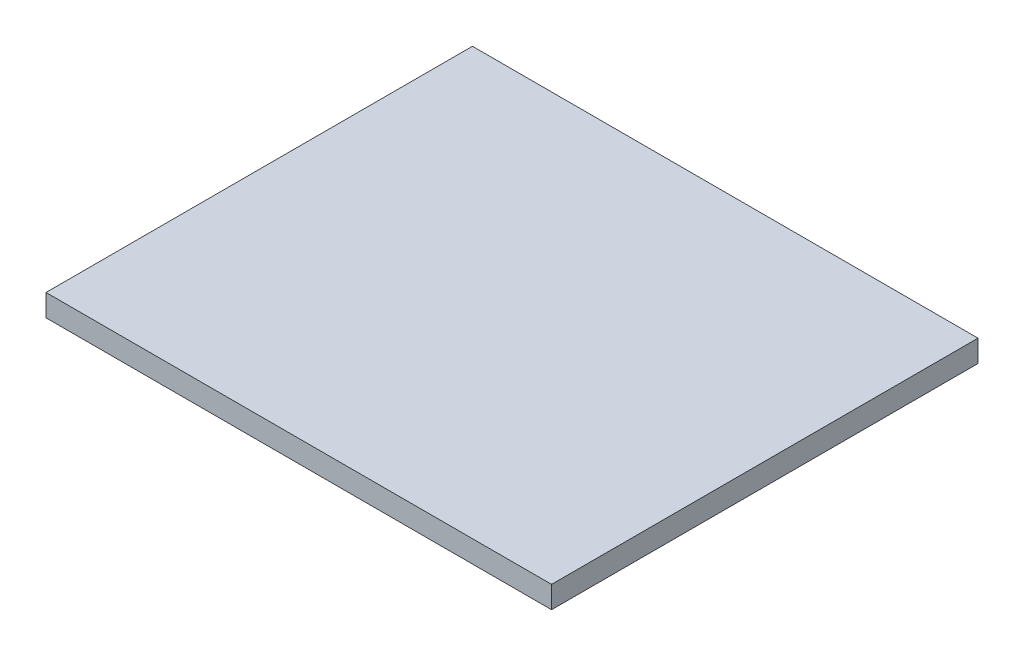
ISO-10303-21;
HEADER;
FILE_DESCRIPTION(('STEP AP214'),'2;1');
FILE_NAME('part.step','',(''),(''),'','','');
FILE_SCHEMA(('AUTOMOTIVE_DESIGN { 1 0 10303 214 1 1 1 1 }'));
ENDSEC;
DATA;
#1=APPLICATION_CONTEXT('core data for automotive mechanical design processes');
#2=APPLICATION_PROTOCOL_DEFINITION('international standard','automotive_design',2000,#1);
#3=PRODUCT_CONTEXT('',#1,'mechanical');
#4=PRODUCT('Part','Part','',(#3));
#5=PRODUCT_RELATED_PRODUCT_CATEGORY('part','',(#4));
#6=PRODUCT_DEFINITION_FORMATION('','',#4);
#7=PRODUCT_DEFINITION_CONTEXT('part definition',#1,'design');
#8=PRODUCT_DEFINITION('design','',#6,#7);
#9=PRODUCT_DEFINITION_SHAPE('','',#8);
#10=(LENGTH_UNIT() NAMED_UNIT(*) SI_UNIT(.MILLI.,.METRE.));
#11=(NAMED_UNIT(*) PLANE_ANGLE_UNIT() SI_UNIT($,.RADIAN.));
#12=(NAMED_UNIT(*) SI_UNIT($,.STERADIAN.) SOLID_ANGLE_UNIT());
#13=UNCERTAINTY_MEASURE_WITH_UNIT(LENGTH_MEASURE(1.E-05),#10,'distance_accuracy_value','');
#14=(GEOMETRIC_REPRESENTATION_CONTEXT(3) GLOBAL_UNCERTAINTY_ASSIGNED_CONTEXT((#13)) GLOBAL_UNIT_ASSIGNED_CONTEXT((#10,
#11,#12)) REPRESENTATION_CONTEXT('',''));
#15=CARTESIAN_POINT('',(0.,0.,0.));
#16=DIRECTION('',(0.,0.,1.));
#17=DIRECTION('',(1.,0.,0.));
#18=AXIS2_PLACEMENT_3D('',#15,#16,#17);
#19=CARTESIAN_POINT('',(0.,10.,0.));
#20=DIRECTION('',(1.,0.,0.));
#21=DIRECTION('',(0.,0.,-1.));
#22=AXIS2_PLACEMENT_3D('',#19,#20,#21);
#23=PLANE('',#22);
#24=DIRECTION('',(0.,0.,1.));
#25=VECTOR('',#24,1.);
#26=CARTESIAN_POINT('',(0.,0.,0.));
#27=LINE('',#26,#25);
#28=CARTESIAN_POINT('',(0.,0.,0.));
#29=VERTEX_POINT('',#28);
#30=CARTESIAN_POINT('',(0.,0.,194.));
#31=VERTEX_POINT('',#30);
#32=EDGE_CURVE('E97',#29,#31,#27,.T.);
#33=ORIENTED_EDGE('',*,*,#32,.T.);
#34=DIRECTION('',(0.,-1.,0.));
#35=VECTOR('',#34,1.);
#36=CARTESIAN_POINT('',(0.,10.,194.));
#37=LINE('',#36,#35);
#38=CARTESIAN_POINT('',(0.,10.,194.));
#39=VERTEX_POINT('',#38);
#40=EDGE_CURVE('E11',#39,#31,#37,.T.);
#41=ORIENTED_EDGE('',*,*,#40,.F.);
#42=DIRECTION('',(0.,0.,1.));
#43=VECTOR('',#42,1.);
#44=CARTESIAN_POINT('',(0.,10.,0.));
#45=LINE('',#44,#43);
#46=CARTESIAN_POINT('',(0.,10.,0.));
#47=VERTEX_POINT('',#46);
#48=EDGE_CURVE('E85',#47,#39,#45,.T.);
#49=ORIENTED_EDGE('',*,*,#48,.F.);
#50=DIRECTION('',(0.,-1.,0.));
#51=VECTOR('',#50,1.);
#52=CARTESIAN_POINT('',(0.,10.,0.));
#53=LINE('',#52,#51);
#54=EDGE_CURVE('E93',#47,#29,#53,.T.);
#55=ORIENTED_EDGE('',*,*,#54,.T.);
#56=EDGE_LOOP('',(#33,#41,#49,#55));
#57=FACE_BOUND('',#56,.T.);
#58=ADVANCED_FACE('F34',(#57),#23,.F.);
#59=CARTESIAN_POINT('',(0.,10.,194.));
#60=DIRECTION('',(0.,0.,-1.));
#61=DIRECTION('',(-1.,0.,0.));
#62=AXIS2_PLACEMENT_3D('',#59,#60,#61);
#63=PLANE('',#62);
#64=DIRECTION('',(1.,0.,0.));
#65=VECTOR('',#64,1.);
#66=CARTESIAN_POINT('',(0.,0.,194.));
#67=LINE('',#66,#65);
#68=CARTESIAN_POINT('',(230.,0.,194.));
#69=VERTEX_POINT('',#68);
#70=EDGE_CURVE('E89',#31,#69,#67,.T.);
#71=ORIENTED_EDGE('',*,*,#70,.T.);
#72=DIRECTION('',(0.,-1.,0.));
#73=VECTOR('',#72,1.);
#74=CARTESIAN_POINT('',(230.,10.,194.));
#75=LINE('',#74,#73);
#76=CARTESIAN_POINT('',(230.,10.,194.));
#77=VERTEX_POINT('',#76);
#78=EDGE_CURVE('E42',#77,#69,#75,.T.);
#79=ORIENTED_EDGE('',*,*,#78,.F.);
#80=DIRECTION('',(1.,0.,0.));
#81=VECTOR('',#80,1.);
#82=CARTESIAN_POINT('',(0.,10.,194.));
#83=LINE('',#82,#81);
#84=EDGE_CURVE('E80',#39,#77,#83,.T.);
#85=ORIENTED_EDGE('',*,*,#84,.F.);
#86=ORIENTED_EDGE('',*,*,#40,.T.);
#87=EDGE_LOOP('',(#71,#79,#85,#86));
#88=FACE_BOUND('',#87,.T.);
#89=ADVANCED_FACE('F88',(#88),#63,.F.);
#90=CARTESIAN_POINT('',(230.,10.,0.));
#91=DIRECTION('',(-1.,0.,0.));
#92=DIRECTION('',(0.,0.,1.));
#93=AXIS2_PLACEMENT_3D('',#90,#91,#92);
#94=PLANE('',#93);
#95=DIRECTION('',(0.,0.,-1.));
#96=VECTOR('',#95,1.);
#97=CARTESIAN_POINT('',(230.,0.,0.));
#98=LINE('',#97,#96);
#99=CARTESIAN_POINT('',(230.,0.,0.));
#100=VERTEX_POINT('',#99);
#101=EDGE_CURVE('E67',#69,#100,#98,.T.);
#102=ORIENTED_EDGE('',*,*,#101,.T.);
#103=DIRECTION('',(0.,-1.,0.));
#104=VECTOR('',#103,1.);
#105=CARTESIAN_POINT('',(230.,10.,0.));
#106=LINE('',#105,#104);
#107=CARTESIAN_POINT('',(230.,10.,0.));
#108=VERTEX_POINT('',#107);
#109=EDGE_CURVE('E90',#108,#100,#106,.T.);
#110=ORIENTED_EDGE('',*,*,#109,.F.);
#111=DIRECTION('',(0.,0.,-1.));
#112=VECTOR('',#111,1.);
#113=CARTESIAN_POINT('',(230.,10.,0.));
#114=LINE('',#113,#112);
#115=EDGE_CURVE('E83',#77,#108,#114,.T.);
#116=ORIENTED_EDGE('',*,*,#115,.F.);
#117=ORIENTED_EDGE('',*,*,#78,.T.);
#118=EDGE_LOOP('',(#102,#110,#116,#117));
#119=FACE_BOUND('',#118,.T.);
#120=ADVANCED_FACE('F91',(#119),#94,.F.);
#121=CARTESIAN_POINT('',(0.,10.,0.));
#122=DIRECTION('',(0.,0.,1.));
#123=DIRECTION('',(1.,0.,0.));
#124=AXIS2_PLACEMENT_3D('',#121,#122,#123);
#125=PLANE('',#124);
#126=DIRECTION('',(-1.,0.,0.));
#127=VECTOR('',#126,1.);
#128=CARTESIAN_POINT('',(0.,0.,0.));
#129=LINE('',#128,#127);
#130=EDGE_CURVE('E73',#100,#29,#129,.T.);
#131=ORIENTED_EDGE('',*,*,#130,.T.);
#132=ORIENTED_EDGE('',*,*,#54,.F.);
#133=DIRECTION('',(-1.,0.,0.));
#134=VECTOR('',#133,1.);
#135=CARTESIAN_POINT('',(0.,10.,0.));
#136=LINE('',#135,#134);
#137=EDGE_CURVE('E50',#108,#47,#136,.T.);
#138=ORIENTED_EDGE('',*,*,#137,.F.);
#139=ORIENTED_EDGE('',*,*,#109,.T.);
#140=EDGE_LOOP('',(#131,#132,#138,#139));
#141=FACE_BOUND('',#140,.T.);
#142=ADVANCED_FACE('F104',(#141),#125,.F.);
#143=CARTESIAN_POINT('',(0.,10.,0.));
#144=DIRECTION('',(0.,1.,0.));
#145=DIRECTION('',(0.,0.,1.));
#146=AXIS2_PLACEMENT_3D('',#143,#144,#145);
#147=PLANE('',#146);
#148=ORIENTED_EDGE('',*,*,#48,.T.);
#149=ORIENTED_EDGE('',*,*,#84,.T.);
#150=ORIENTED_EDGE('',*,*,#115,.T.);
#151=ORIENTED_EDGE('',*,*,#137,.T.);
#152=EDGE_LOOP('',(#148,#149,#150,#151));
#153=FACE_BOUND('',#152,.T.);
#154=ADVANCED_FACE('F81',(#153),#147,.T.);
#155=CARTESIAN_POINT('',(0.,0.,0.));
#156=DIRECTION('',(0.,1.,0.));
#157=DIRECTION('',(0.,0.,1.));
#158=AXIS2_PLACEMENT_3D('',#155,#156,#157);
#159=PLANE('',#158);
#160=ORIENTED_EDGE('',*,*,#32,.F.);
#161=ORIENTED_EDGE('',*,*,#130,.F.);
#162=ORIENTED_EDGE('',*,*,#101,.F.);
#163=ORIENTED_EDGE('',*,*,#70,.F.);
#164=EDGE_LOOP('',(#160,#161,#162,#163));
#165=FACE_BOUND('',#164,.T.);
#166=ADVANCED_FACE('F107',(#165),#159,.F.);
#167=CLOSED_SHELL('',(#58,#89,#120,#142,#154,#166));
#168=MANIFOLD_SOLID_BREP('B2',#167);
#169=ADVANCED_BREP_SHAPE_REPRESENTATION('',(#18,#168),#14);
#170=SHAPE_DEFINITION_REPRESENTATION(#9,#169);
ENDSEC;
END-ISO-10303-21;
